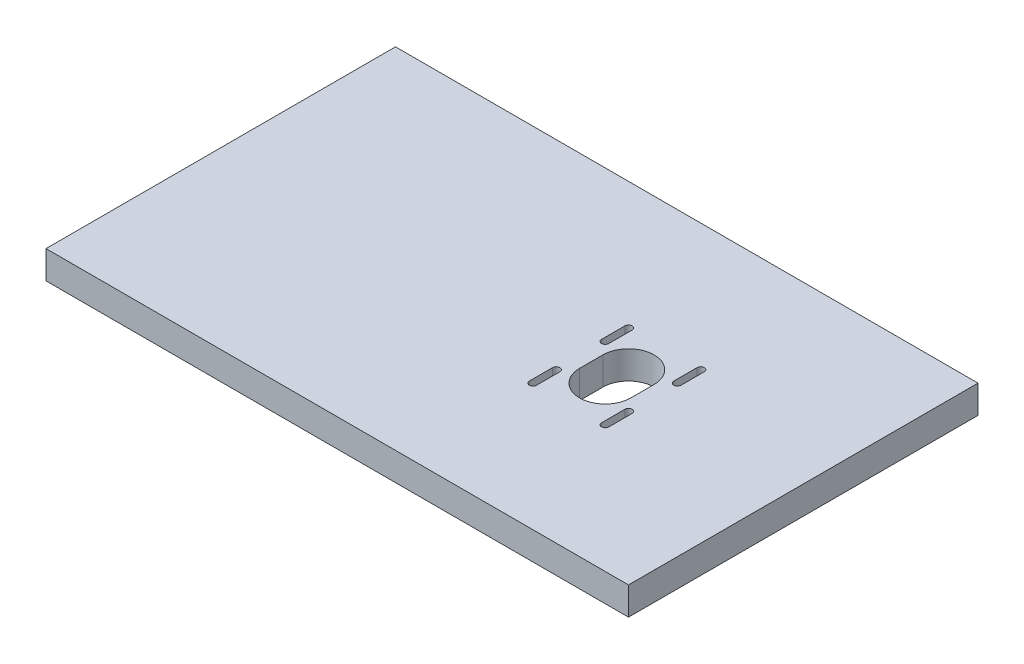
ISO-10303-21;
HEADER;
FILE_DESCRIPTION(('STEP AP214'),'2;1');
FILE_NAME('part.step','',(''),(''),'','','');
FILE_SCHEMA(('AUTOMOTIVE_DESIGN { 1 0 10303 214 1 1 1 1 }'));
ENDSEC;
DATA;
#1=APPLICATION_CONTEXT('core data for automotive mechanical design processes');
#2=APPLICATION_PROTOCOL_DEFINITION('international standard','automotive_design',2000,#1);
#3=PRODUCT_CONTEXT('',#1,'mechanical');
#4=PRODUCT('Part','Part','',(#3));
#5=PRODUCT_RELATED_PRODUCT_CATEGORY('part','',(#4));
#6=PRODUCT_DEFINITION_FORMATION('','',#4);
#7=PRODUCT_DEFINITION_CONTEXT('part definition',#1,'design');
#8=PRODUCT_DEFINITION('design','',#6,#7);
#9=PRODUCT_DEFINITION_SHAPE('','',#8);
#10=(LENGTH_UNIT() NAMED_UNIT(*) SI_UNIT(.MILLI.,.METRE.));
#11=(NAMED_UNIT(*) PLANE_ANGLE_UNIT() SI_UNIT($,.RADIAN.));
#12=(NAMED_UNIT(*) SI_UNIT($,.STERADIAN.) SOLID_ANGLE_UNIT());
#13=UNCERTAINTY_MEASURE_WITH_UNIT(LENGTH_MEASURE(1.E-05),#10,'distance_accuracy_value','');
#14=(GEOMETRIC_REPRESENTATION_CONTEXT(3) GLOBAL_UNCERTAINTY_ASSIGNED_CONTEXT((#13)) GLOBAL_UNIT_ASSIGNED_CONTEXT((#10,
#11,#12)) REPRESENTATION_CONTEXT('',''));
#15=CARTESIAN_POINT('',(0.,0.,0.));
#16=DIRECTION('',(0.,0.,1.));
#17=DIRECTION('',(1.,0.,0.));
#18=AXIS2_PLACEMENT_3D('',#15,#16,#17);
#19=CARTESIAN_POINT('',(0.,12.,0.));
#20=DIRECTION('',(0.,1.,0.));
#21=DIRECTION('',(0.,0.,1.));
#22=AXIS2_PLACEMENT_3D('',#19,#20,#21);
#23=PLANE('',#22);
#24=DIRECTION('',(0.,0.,-1.));
#25=VECTOR('',#24,1.);
#26=CARTESIAN_POINT('',(125.,12.,-75.));
#27=LINE('',#26,#25);
#28=CARTESIAN_POINT('',(125.,12.,75.));
#29=VERTEX_POINT('',#28);
#30=CARTESIAN_POINT('',(125.,12.,-75.));
#31=VERTEX_POINT('',#30);
#32=EDGE_CURVE('E356',#29,#31,#27,.T.);
#33=ORIENTED_EDGE('',*,*,#32,.T.);
#34=DIRECTION('',(-1.,0.,0.));
#35=VECTOR('',#34,1.);
#36=CARTESIAN_POINT('',(-125.,12.,-75.));
#37=LINE('',#36,#35);
#38=CARTESIAN_POINT('',(-125.,12.,-75.));
#39=VERTEX_POINT('',#38);
#40=EDGE_CURVE('E359',#31,#39,#37,.T.);
#41=ORIENTED_EDGE('',*,*,#40,.T.);
#42=DIRECTION('',(0.,0.,1.));
#43=VECTOR('',#42,1.);
#44=CARTESIAN_POINT('',(-125.,12.,-75.));
#45=LINE('',#44,#43);
#46=CARTESIAN_POINT('',(-125.,12.,75.));
#47=VERTEX_POINT('',#46);
#48=EDGE_CURVE('E362',#39,#47,#45,.T.);
#49=ORIENTED_EDGE('',*,*,#48,.T.);
#50=DIRECTION('',(1.,0.,0.));
#51=VECTOR('',#50,1.);
#52=CARTESIAN_POINT('',(-125.,12.,75.));
#53=LINE('',#52,#51);
#54=EDGE_CURVE('E364',#47,#29,#53,.T.);
#55=ORIENTED_EDGE('',*,*,#54,.T.);
#56=EDGE_LOOP('',(#33,#41,#49,#55));
#57=FACE_BOUND('',#56,.T.);
#58=DIRECTION('',(0.,0.,-1.));
#59=VECTOR('',#58,1.);
#60=CARTESIAN_POINT('',(31.05,12.,-10.5));
#61=LINE('',#60,#59);
#62=CARTESIAN_POINT('',(31.05,12.,-10.5));
#63=VERTEX_POINT('',#62);
#64=CARTESIAN_POINT('',(31.05,12.,-20.5000000000001));
#65=VERTEX_POINT('',#64);
#66=EDGE_CURVE('E327',#63,#65,#61,.T.);
#67=ORIENTED_EDGE('',*,*,#66,.F.);
#68=CARTESIAN_POINT('',(29.5,12.,-10.5));
#69=DIRECTION('',(0.,1.,0.));
#70=DIRECTION('',(0.,0.,1.));
#71=AXIS2_PLACEMENT_3D('',#68,#69,#70);
#72=CIRCLE('',#71,1.55000000000001);
#73=CARTESIAN_POINT('',(27.9499999999999,12.,-10.5));
#74=VERTEX_POINT('',#73);
#75=EDGE_CURVE('E325',#74,#63,#72,.T.);
#76=ORIENTED_EDGE('',*,*,#75,.F.);
#77=DIRECTION('',(0.,0.,1.));
#78=VECTOR('',#77,1.);
#79=CARTESIAN_POINT('',(27.9499999999999,12.,-10.5));
#80=LINE('',#79,#78);
#81=CARTESIAN_POINT('',(27.9499999999999,12.,-20.5000000000001));
#82=VERTEX_POINT('',#81);
#83=EDGE_CURVE('E333',#82,#74,#80,.T.);
#84=ORIENTED_EDGE('',*,*,#83,.F.);
#85=CARTESIAN_POINT('',(29.5,12.,-20.5000000000001));
#86=DIRECTION('',(0.,1.,0.));
#87=DIRECTION('',(0.,0.,1.));
#88=AXIS2_PLACEMENT_3D('',#85,#86,#87);
#89=CIRCLE('',#88,1.55000000000002);
#90=EDGE_CURVE('E330',#65,#82,#89,.T.);
#91=ORIENTED_EDGE('',*,*,#90,.F.);
#92=EDGE_LOOP('',(#67,#76,#84,#91));
#93=FACE_BOUND('',#92,.T.);
#94=DIRECTION('',(0.,0.,1.));
#95=VECTOR('',#94,1.);
#96=CARTESIAN_POINT('',(58.95,12.,-20.5000000000001));
#97=LINE('',#96,#95);
#98=CARTESIAN_POINT('',(58.95,12.,-20.5000000000001));
#99=VERTEX_POINT('',#98);
#100=CARTESIAN_POINT('',(58.95,12.,-10.5));
#101=VERTEX_POINT('',#100);
#102=EDGE_CURVE('E296',#99,#101,#97,.T.);
#103=ORIENTED_EDGE('',*,*,#102,.F.);
#104=CARTESIAN_POINT('',(60.5,12.,-20.5000000000001));
#105=DIRECTION('',(0.,1.,0.));
#106=DIRECTION('',(0.,0.,1.));
#107=AXIS2_PLACEMENT_3D('',#104,#105,#106);
#108=CIRCLE('',#107,1.55);
#109=CARTESIAN_POINT('',(62.05,12.,-20.5000000000001));
#110=VERTEX_POINT('',#109);
#111=EDGE_CURVE('E294',#110,#99,#108,.T.);
#112=ORIENTED_EDGE('',*,*,#111,.F.);
#113=DIRECTION('',(0.,0.,-1.));
#114=VECTOR('',#113,1.);
#115=CARTESIAN_POINT('',(62.05,12.,-20.5000000000001));
#116=LINE('',#115,#114);
#117=CARTESIAN_POINT('',(62.05,12.,-10.5));
#118=VERTEX_POINT('',#117);
#119=EDGE_CURVE('E302',#118,#110,#116,.T.);
#120=ORIENTED_EDGE('',*,*,#119,.F.);
#121=CARTESIAN_POINT('',(60.5,12.,-10.5));
#122=DIRECTION('',(0.,1.,0.));
#123=DIRECTION('',(0.,0.,1.));
#124=AXIS2_PLACEMENT_3D('',#121,#122,#123);
#125=CIRCLE('',#124,1.55);
#126=EDGE_CURVE('E299',#101,#118,#125,.T.);
#127=ORIENTED_EDGE('',*,*,#126,.F.);
#128=EDGE_LOOP('',(#103,#112,#120,#127));
#129=FACE_BOUND('',#128,.T.);
#130=DIRECTION('',(0.,0.,-1.));
#131=VECTOR('',#130,1.);
#132=CARTESIAN_POINT('',(62.05,12.,20.5));
#133=LINE('',#132,#131);
#134=CARTESIAN_POINT('',(62.05,12.,20.5));
#135=VERTEX_POINT('',#134);
#136=CARTESIAN_POINT('',(62.0500000000001,12.,10.5));
#137=VERTEX_POINT('',#136);
#138=EDGE_CURVE('E265',#135,#137,#133,.T.);
#139=ORIENTED_EDGE('',*,*,#138,.F.);
#140=CARTESIAN_POINT('',(60.5000000000001,12.,20.5));
#141=DIRECTION('',(0.,1.,0.));
#142=DIRECTION('',(0.,0.,1.));
#143=AXIS2_PLACEMENT_3D('',#140,#141,#142);
#144=CIRCLE('',#143,1.55000000000001);
#145=CARTESIAN_POINT('',(58.95,12.,20.5));
#146=VERTEX_POINT('',#145);
#147=EDGE_CURVE('E263',#146,#135,#144,.T.);
#148=ORIENTED_EDGE('',*,*,#147,.F.);
#149=DIRECTION('',(0.,0.,1.));
#150=VECTOR('',#149,1.);
#151=CARTESIAN_POINT('',(58.95,12.,20.5));
#152=LINE('',#151,#150);
#153=CARTESIAN_POINT('',(58.95,12.,10.5));
#154=VERTEX_POINT('',#153);
#155=EDGE_CURVE('E271',#154,#146,#152,.T.);
#156=ORIENTED_EDGE('',*,*,#155,.F.);
#157=CARTESIAN_POINT('',(60.5000000000001,12.,10.5));
#158=DIRECTION('',(0.,1.,0.));
#159=DIRECTION('',(0.,0.,1.));
#160=AXIS2_PLACEMENT_3D('',#157,#158,#159);
#161=CIRCLE('',#160,1.55000000000001);
#162=EDGE_CURVE('E268',#137,#154,#161,.T.);
#163=ORIENTED_EDGE('',*,*,#162,.F.);
#164=EDGE_LOOP('',(#139,#148,#156,#163));
#165=FACE_BOUND('',#164,.T.);
#166=DIRECTION('',(0.,0.,-1.));
#167=VECTOR('',#166,1.);
#168=CARTESIAN_POINT('',(31.05,12.,20.5));
#169=LINE('',#168,#167);
#170=CARTESIAN_POINT('',(31.05,12.,20.5));
#171=VERTEX_POINT('',#170);
#172=CARTESIAN_POINT('',(31.05,12.,10.5));
#173=VERTEX_POINT('',#172);
#174=EDGE_CURVE('E234',#171,#173,#169,.T.);
#175=ORIENTED_EDGE('',*,*,#174,.F.);
#176=CARTESIAN_POINT('',(29.5,12.,20.5));
#177=DIRECTION('',(0.,1.,0.));
#178=DIRECTION('',(0.,0.,1.));
#179=AXIS2_PLACEMENT_3D('',#176,#177,#178);
#180=CIRCLE('',#179,1.55);
#181=CARTESIAN_POINT('',(27.95,12.,20.5));
#182=VERTEX_POINT('',#181);
#183=EDGE_CURVE('E232',#182,#171,#180,.T.);
#184=ORIENTED_EDGE('',*,*,#183,.F.);
#185=DIRECTION('',(0.,0.,1.));
#186=VECTOR('',#185,1.);
#187=CARTESIAN_POINT('',(27.95,12.,20.5));
#188=LINE('',#187,#186);
#189=CARTESIAN_POINT('',(27.95,12.,10.5));
#190=VERTEX_POINT('',#189);
#191=EDGE_CURVE('E240',#190,#182,#188,.T.);
#192=ORIENTED_EDGE('',*,*,#191,.F.);
#193=CARTESIAN_POINT('',(29.5,12.,10.5));
#194=DIRECTION('',(0.,1.,0.));
#195=DIRECTION('',(0.,0.,1.));
#196=AXIS2_PLACEMENT_3D('',#193,#194,#195);
#197=CIRCLE('',#196,1.55);
#198=EDGE_CURVE('E237',#173,#190,#197,.T.);
#199=ORIENTED_EDGE('',*,*,#198,.F.);
#200=EDGE_LOOP('',(#175,#184,#192,#199));
#201=FACE_BOUND('',#200,.T.);
#202=DIRECTION('',(0.,0.,1.));
#203=VECTOR('',#202,1.);
#204=CARTESIAN_POINT('',(34.,12.,-5.00000000000009));
#205=LINE('',#204,#203);
#206=CARTESIAN_POINT('',(34.,12.,-5.00000000000009));
#207=VERTEX_POINT('',#206);
#208=CARTESIAN_POINT('',(34.,12.,5.));
#209=VERTEX_POINT('',#208);
#210=EDGE_CURVE('E204',#207,#209,#205,.T.);
#211=ORIENTED_EDGE('',*,*,#210,.F.);
#212=CARTESIAN_POINT('',(45.,12.,-5.0000000000001));
#213=DIRECTION('',(0.,1.,0.));
#214=DIRECTION('',(0.,0.,1.));
#215=AXIS2_PLACEMENT_3D('',#212,#213,#214);
#216=CIRCLE('',#215,11.);
#217=CARTESIAN_POINT('',(56.,12.,-5.00000000000011));
#218=VERTEX_POINT('',#217);
#219=EDGE_CURVE('E196',#218,#207,#216,.T.);
#220=ORIENTED_EDGE('',*,*,#219,.F.);
#221=DIRECTION('',(0.,0.,-1.));
#222=VECTOR('',#221,1.);
#223=CARTESIAN_POINT('',(56.,12.,-5.00000000000011));
#224=LINE('',#223,#222);
#225=CARTESIAN_POINT('',(56.,12.,5.));
#226=VERTEX_POINT('',#225);
#227=EDGE_CURVE('E218',#226,#218,#224,.T.);
#228=ORIENTED_EDGE('',*,*,#227,.F.);
#229=CARTESIAN_POINT('',(45.,12.,5.));
#230=DIRECTION('',(0.,1.,0.));
#231=DIRECTION('',(0.,0.,1.));
#232=AXIS2_PLACEMENT_3D('',#229,#230,#231);
#233=CIRCLE('',#232,11.);
#234=EDGE_CURVE('E216',#209,#226,#233,.T.);
#235=ORIENTED_EDGE('',*,*,#234,.F.);
#236=EDGE_LOOP('',(#211,#220,#228,#235));
#237=FACE_BOUND('',#236,.T.);
#238=ADVANCED_FACE('F35',(#57,#93,#129,#165,#201,#237),#23,.T.);
#239=CARTESIAN_POINT('',(0.,0.,0.));
#240=DIRECTION('',(0.,1.,0.));
#241=DIRECTION('',(0.,0.,1.));
#242=AXIS2_PLACEMENT_3D('',#239,#240,#241);
#243=PLANE('',#242);
#244=CARTESIAN_POINT('',(29.5,0.,20.5));
#245=DIRECTION('',(0.,1.,0.));
#246=DIRECTION('',(0.,0.,1.));
#247=AXIS2_PLACEMENT_3D('',#244,#245,#246);
#248=CIRCLE('',#247,1.55);
#249=CARTESIAN_POINT('',(27.95,0.,20.5));
#250=VERTEX_POINT('',#249);
#251=CARTESIAN_POINT('',(31.05,0.,20.5));
#252=VERTEX_POINT('',#251);
#253=EDGE_CURVE('E212',#250,#252,#248,.T.);
#254=ORIENTED_EDGE('',*,*,#253,.T.);
#255=DIRECTION('',(0.,0.,-1.));
#256=VECTOR('',#255,1.);
#257=CARTESIAN_POINT('',(31.05,0.,20.5));
#258=LINE('',#257,#256);
#259=CARTESIAN_POINT('',(31.05,0.,10.5));
#260=VERTEX_POINT('',#259);
#261=EDGE_CURVE('E245',#252,#260,#258,.T.);
#262=ORIENTED_EDGE('',*,*,#261,.T.);
#263=CARTESIAN_POINT('',(29.5,0.,10.5));
#264=DIRECTION('',(0.,1.,0.));
#265=DIRECTION('',(0.,0.,1.));
#266=AXIS2_PLACEMENT_3D('',#263,#264,#265);
#267=CIRCLE('',#266,1.55);
#268=CARTESIAN_POINT('',(27.95,0.,10.5));
#269=VERTEX_POINT('',#268);
#270=EDGE_CURVE('E248',#260,#269,#267,.T.);
#271=ORIENTED_EDGE('',*,*,#270,.T.);
#272=DIRECTION('',(0.,0.,1.));
#273=VECTOR('',#272,1.);
#274=CARTESIAN_POINT('',(27.95,0.,20.5));
#275=LINE('',#274,#273);
#276=EDGE_CURVE('E235',#269,#250,#275,.T.);
#277=ORIENTED_EDGE('',*,*,#276,.T.);
#278=EDGE_LOOP('',(#254,#262,#271,#277));
#279=FACE_BOUND('',#278,.T.);
#280=CARTESIAN_POINT('',(60.5,0.,-20.5000000000001));
#281=DIRECTION('',(0.,1.,0.));
#282=DIRECTION('',(0.,0.,1.));
#283=AXIS2_PLACEMENT_3D('',#280,#281,#282);
#284=CIRCLE('',#283,1.55);
#285=CARTESIAN_POINT('',(62.05,0.,-20.5000000000001));
#286=VERTEX_POINT('',#285);
#287=CARTESIAN_POINT('',(58.95,0.,-20.5000000000001));
#288=VERTEX_POINT('',#287);
#289=EDGE_CURVE('E293',#286,#288,#284,.T.);
#290=ORIENTED_EDGE('',*,*,#289,.T.);
#291=DIRECTION('',(0.,0.,1.));
#292=VECTOR('',#291,1.);
#293=CARTESIAN_POINT('',(58.95,0.,-20.5000000000001));
#294=LINE('',#293,#292);
#295=CARTESIAN_POINT('',(58.95,0.,-10.5));
#296=VERTEX_POINT('',#295);
#297=EDGE_CURVE('E307',#288,#296,#294,.T.);
#298=ORIENTED_EDGE('',*,*,#297,.T.);
#299=CARTESIAN_POINT('',(60.5,0.,-10.5));
#300=DIRECTION('',(0.,1.,0.));
#301=DIRECTION('',(0.,0.,1.));
#302=AXIS2_PLACEMENT_3D('',#299,#300,#301);
#303=CIRCLE('',#302,1.55);
#304=CARTESIAN_POINT('',(62.05,0.,-10.5));
#305=VERTEX_POINT('',#304);
#306=EDGE_CURVE('E310',#296,#305,#303,.T.);
#307=ORIENTED_EDGE('',*,*,#306,.T.);
#308=DIRECTION('',(0.,0.,-1.));
#309=VECTOR('',#308,1.);
#310=CARTESIAN_POINT('',(62.05,0.,-20.5000000000001));
#311=LINE('',#310,#309);
#312=EDGE_CURVE('E297',#305,#286,#311,.T.);
#313=ORIENTED_EDGE('',*,*,#312,.T.);
#314=EDGE_LOOP('',(#290,#298,#307,#313));
#315=FACE_BOUND('',#314,.T.);
#316=DIRECTION('',(0.,0.,-1.));
#317=VECTOR('',#316,1.);
#318=CARTESIAN_POINT('',(125.,0.,-75.));
#319=LINE('',#318,#317);
#320=CARTESIAN_POINT('',(125.,0.,75.));
#321=VERTEX_POINT('',#320);
#322=CARTESIAN_POINT('',(125.,0.,-75.));
#323=VERTEX_POINT('',#322);
#324=EDGE_CURVE('E355',#321,#323,#319,.T.);
#325=ORIENTED_EDGE('',*,*,#324,.F.);
#326=DIRECTION('',(1.,0.,0.));
#327=VECTOR('',#326,1.);
#328=CARTESIAN_POINT('',(-125.,0.,75.));
#329=LINE('',#328,#327);
#330=CARTESIAN_POINT('',(-125.,0.,75.));
#331=VERTEX_POINT('',#330);
#332=EDGE_CURVE('E360',#331,#321,#329,.T.);
#333=ORIENTED_EDGE('',*,*,#332,.F.);
#334=DIRECTION('',(0.,0.,1.));
#335=VECTOR('',#334,1.);
#336=CARTESIAN_POINT('',(-125.,0.,-75.));
#337=LINE('',#336,#335);
#338=CARTESIAN_POINT('',(-125.,0.,-75.));
#339=VERTEX_POINT('',#338);
#340=EDGE_CURVE('E371',#339,#331,#337,.T.);
#341=ORIENTED_EDGE('',*,*,#340,.F.);
#342=DIRECTION('',(-1.,0.,0.));
#343=VECTOR('',#342,1.);
#344=CARTESIAN_POINT('',(-125.,0.,-75.));
#345=LINE('',#344,#343);
#346=EDGE_CURVE('E369',#323,#339,#345,.T.);
#347=ORIENTED_EDGE('',*,*,#346,.F.);
#348=EDGE_LOOP('',(#325,#333,#341,#347));
#349=FACE_BOUND('',#348,.T.);
#350=CARTESIAN_POINT('',(29.5,0.,-10.5));
#351=DIRECTION('',(0.,1.,0.));
#352=DIRECTION('',(0.,0.,1.));
#353=AXIS2_PLACEMENT_3D('',#350,#351,#352);
#354=CIRCLE('',#353,1.55000000000001);
#355=CARTESIAN_POINT('',(27.9499999999999,0.,-10.5));
#356=VERTEX_POINT('',#355);
#357=CARTESIAN_POINT('',(31.05,0.,-10.5));
#358=VERTEX_POINT('',#357);
#359=EDGE_CURVE('E324',#356,#358,#354,.T.);
#360=ORIENTED_EDGE('',*,*,#359,.T.);
#361=DIRECTION('',(0.,0.,-1.));
#362=VECTOR('',#361,1.);
#363=CARTESIAN_POINT('',(31.05,0.,-10.5));
#364=LINE('',#363,#362);
#365=CARTESIAN_POINT('',(31.05,0.,-20.5000000000001));
#366=VERTEX_POINT('',#365);
#367=EDGE_CURVE('E338',#358,#366,#364,.T.);
#368=ORIENTED_EDGE('',*,*,#367,.T.);
#369=CARTESIAN_POINT('',(29.5,0.,-20.5000000000001));
#370=DIRECTION('',(0.,1.,0.));
#371=DIRECTION('',(0.,0.,1.));
#372=AXIS2_PLACEMENT_3D('',#369,#370,#371);
#373=CIRCLE('',#372,1.55000000000002);
#374=CARTESIAN_POINT('',(27.9499999999999,0.,-20.5000000000001));
#375=VERTEX_POINT('',#374);
#376=EDGE_CURVE('E341',#366,#375,#373,.T.);
#377=ORIENTED_EDGE('',*,*,#376,.T.);
#378=DIRECTION('',(0.,0.,1.));
#379=VECTOR('',#378,1.);
#380=CARTESIAN_POINT('',(27.9499999999999,0.,-10.5));
#381=LINE('',#380,#379);
#382=EDGE_CURVE('E328',#375,#356,#381,.T.);
#383=ORIENTED_EDGE('',*,*,#382,.T.);
#384=EDGE_LOOP('',(#360,#368,#377,#383));
#385=FACE_BOUND('',#384,.T.);
#386=CARTESIAN_POINT('',(60.5000000000001,0.,20.5));
#387=DIRECTION('',(0.,1.,0.));
#388=DIRECTION('',(0.,0.,1.));
#389=AXIS2_PLACEMENT_3D('',#386,#387,#388);
#390=CIRCLE('',#389,1.55000000000001);
#391=CARTESIAN_POINT('',(58.95,0.,20.5));
#392=VERTEX_POINT('',#391);
#393=CARTESIAN_POINT('',(62.05,0.,20.5));
#394=VERTEX_POINT('',#393);
#395=EDGE_CURVE('E262',#392,#394,#390,.T.);
#396=ORIENTED_EDGE('',*,*,#395,.T.);
#397=DIRECTION('',(0.,0.,-1.));
#398=VECTOR('',#397,1.);
#399=CARTESIAN_POINT('',(62.05,0.,20.5));
#400=LINE('',#399,#398);
#401=CARTESIAN_POINT('',(62.0500000000001,0.,10.5));
#402=VERTEX_POINT('',#401);
#403=EDGE_CURVE('E276',#394,#402,#400,.T.);
#404=ORIENTED_EDGE('',*,*,#403,.T.);
#405=CARTESIAN_POINT('',(60.5000000000001,0.,10.5));
#406=DIRECTION('',(0.,1.,0.));
#407=DIRECTION('',(0.,0.,1.));
#408=AXIS2_PLACEMENT_3D('',#405,#406,#407);
#409=CIRCLE('',#408,1.55000000000001);
#410=CARTESIAN_POINT('',(58.95,0.,10.5));
#411=VERTEX_POINT('',#410);
#412=EDGE_CURVE('E279',#402,#411,#409,.T.);
#413=ORIENTED_EDGE('',*,*,#412,.T.);
#414=DIRECTION('',(0.,0.,1.));
#415=VECTOR('',#414,1.);
#416=CARTESIAN_POINT('',(58.95,0.,20.5));
#417=LINE('',#416,#415);
#418=EDGE_CURVE('E266',#411,#392,#417,.T.);
#419=ORIENTED_EDGE('',*,*,#418,.T.);
#420=EDGE_LOOP('',(#396,#404,#413,#419));
#421=FACE_BOUND('',#420,.T.);
#422=CARTESIAN_POINT('',(45.,0.,-5.0000000000001));
#423=DIRECTION('',(0.,1.,0.));
#424=DIRECTION('',(0.,0.,1.));
#425=AXIS2_PLACEMENT_3D('',#422,#423,#424);
#426=CIRCLE('',#425,11.);
#427=CARTESIAN_POINT('',(56.,0.,-5.00000000000011));
#428=VERTEX_POINT('',#427);
#429=CARTESIAN_POINT('',(34.,0.,-5.00000000000009));
#430=VERTEX_POINT('',#429);
#431=EDGE_CURVE('E58',#428,#430,#426,.T.);
#432=ORIENTED_EDGE('',*,*,#431,.T.);
#433=DIRECTION('',(0.,0.,1.));
#434=VECTOR('',#433,1.);
#435=CARTESIAN_POINT('',(34.,0.,-5.00000000000009));
#436=LINE('',#435,#434);
#437=CARTESIAN_POINT('',(34.,0.,5.));
#438=VERTEX_POINT('',#437);
#439=EDGE_CURVE('E211',#430,#438,#436,.T.);
#440=ORIENTED_EDGE('',*,*,#439,.T.);
#441=CARTESIAN_POINT('',(45.,0.,5.));
#442=DIRECTION('',(0.,1.,0.));
#443=DIRECTION('',(0.,0.,1.));
#444=AXIS2_PLACEMENT_3D('',#441,#442,#443);
#445=CIRCLE('',#444,11.);
#446=CARTESIAN_POINT('',(56.,0.,5.));
#447=VERTEX_POINT('',#446);
#448=EDGE_CURVE('E224',#438,#447,#445,.T.);
#449=ORIENTED_EDGE('',*,*,#448,.T.);
#450=DIRECTION('',(0.,0.,-1.));
#451=VECTOR('',#450,1.);
#452=CARTESIAN_POINT('',(56.,0.,-5.00000000000011));
#453=LINE('',#452,#451);
#454=EDGE_CURVE('E205',#447,#428,#453,.T.);
#455=ORIENTED_EDGE('',*,*,#454,.T.);
#456=EDGE_LOOP('',(#432,#440,#449,#455));
#457=FACE_BOUND('',#456,.T.);
#458=ADVANCED_FACE('F389',(#279,#315,#349,#385,#421,#457),#243,.F.);
#459=CARTESIAN_POINT('',(125.,12.,-75.));
#460=DIRECTION('',(-1.,0.,0.));
#461=DIRECTION('',(0.,0.,1.));
#462=AXIS2_PLACEMENT_3D('',#459,#460,#461);
#463=PLANE('',#462);
#464=ORIENTED_EDGE('',*,*,#324,.T.);
#465=DIRECTION('',(0.,-1.,0.));
#466=VECTOR('',#465,1.);
#467=CARTESIAN_POINT('',(125.,12.,-75.));
#468=LINE('',#467,#466);
#469=EDGE_CURVE('E11',#31,#323,#468,.T.);
#470=ORIENTED_EDGE('',*,*,#469,.F.);
#471=ORIENTED_EDGE('',*,*,#32,.F.);
#472=DIRECTION('',(0.,-1.,0.));
#473=VECTOR('',#472,1.);
#474=CARTESIAN_POINT('',(125.,12.,75.));
#475=LINE('',#474,#473);
#476=EDGE_CURVE('E366',#29,#321,#475,.T.);
#477=ORIENTED_EDGE('',*,*,#476,.T.);
#478=EDGE_LOOP('',(#464,#470,#471,#477));
#479=FACE_BOUND('',#478,.T.);
#480=ADVANCED_FACE('F37',(#479),#463,.F.);
#481=CARTESIAN_POINT('',(-125.,12.,-75.));
#482=DIRECTION('',(0.,0.,1.));
#483=DIRECTION('',(1.,0.,0.));
#484=AXIS2_PLACEMENT_3D('',#481,#482,#483);
#485=PLANE('',#484);
#486=ORIENTED_EDGE('',*,*,#346,.T.);
#487=DIRECTION('',(0.,-1.,0.));
#488=VECTOR('',#487,1.);
#489=CARTESIAN_POINT('',(-125.,12.,-75.));
#490=LINE('',#489,#488);
#491=EDGE_CURVE('E43',#39,#339,#490,.T.);
#492=ORIENTED_EDGE('',*,*,#491,.F.);
#493=ORIENTED_EDGE('',*,*,#40,.F.);
#494=ORIENTED_EDGE('',*,*,#469,.T.);
#495=EDGE_LOOP('',(#486,#492,#493,#494));
#496=FACE_BOUND('',#495,.T.);
#497=ADVANCED_FACE('F400',(#496),#485,.F.);
#498=CARTESIAN_POINT('',(-125.,12.,-75.));
#499=DIRECTION('',(1.,0.,0.));
#500=DIRECTION('',(0.,0.,-1.));
#501=AXIS2_PLACEMENT_3D('',#498,#499,#500);
#502=PLANE('',#501);
#503=ORIENTED_EDGE('',*,*,#340,.T.);
#504=DIRECTION('',(0.,-1.,0.));
#505=VECTOR('',#504,1.);
#506=CARTESIAN_POINT('',(-125.,12.,75.));
#507=LINE('',#506,#505);
#508=EDGE_CURVE('E376',#47,#331,#507,.T.);
#509=ORIENTED_EDGE('',*,*,#508,.F.);
#510=ORIENTED_EDGE('',*,*,#48,.F.);
#511=ORIENTED_EDGE('',*,*,#491,.T.);
#512=EDGE_LOOP('',(#503,#509,#510,#511));
#513=FACE_BOUND('',#512,.T.);
#514=ADVANCED_FACE('F383',(#513),#502,.F.);
#515=CARTESIAN_POINT('',(-125.,12.,75.));
#516=DIRECTION('',(0.,0.,-1.));
#517=DIRECTION('',(-1.,0.,0.));
#518=AXIS2_PLACEMENT_3D('',#515,#516,#517);
#519=PLANE('',#518);
#520=ORIENTED_EDGE('',*,*,#332,.T.);
#521=ORIENTED_EDGE('',*,*,#476,.F.);
#522=ORIENTED_EDGE('',*,*,#54,.F.);
#523=ORIENTED_EDGE('',*,*,#508,.T.);
#524=EDGE_LOOP('',(#520,#521,#522,#523));
#525=FACE_BOUND('',#524,.T.);
#526=ADVANCED_FACE('F393',(#525),#519,.F.);
#527=CARTESIAN_POINT('',(29.5,12.,-10.5));
#528=DIRECTION('',(0.,-1.,0.));
#529=DIRECTION('',(0.,0.,-1.));
#530=AXIS2_PLACEMENT_3D('',#527,#528,#529);
#531=CYLINDRICAL_SURFACE('',#530,1.55000000000001);
#532=ORIENTED_EDGE('',*,*,#359,.F.);
#533=DIRECTION('',(0.,-1.,0.));
#534=VECTOR('',#533,1.);
#535=CARTESIAN_POINT('',(27.9499999999999,12.,-10.5));
#536=LINE('',#535,#534);
#537=EDGE_CURVE('E335',#74,#356,#536,.T.);
#538=ORIENTED_EDGE('',*,*,#537,.F.);
#539=ORIENTED_EDGE('',*,*,#75,.T.);
#540=DIRECTION('',(0.,-1.,0.));
#541=VECTOR('',#540,1.);
#542=CARTESIAN_POINT('',(31.05,12.,-10.5));
#543=LINE('',#542,#541);
#544=EDGE_CURVE('E352',#63,#358,#543,.T.);
#545=ORIENTED_EDGE('',*,*,#544,.T.);
#546=EDGE_LOOP('',(#532,#538,#539,#545));
#547=FACE_BOUND('',#546,.T.);
#548=ADVANCED_FACE('F415',(#547),#531,.F.);
#549=CARTESIAN_POINT('',(31.05,12.,-10.5));
#550=DIRECTION('',(-1.,0.,0.));
#551=DIRECTION('',(0.,0.,1.));
#552=AXIS2_PLACEMENT_3D('',#549,#550,#551);
#553=PLANE('',#552);
#554=ORIENTED_EDGE('',*,*,#367,.F.);
#555=ORIENTED_EDGE('',*,*,#544,.F.);
#556=ORIENTED_EDGE('',*,*,#66,.T.);
#557=DIRECTION('',(0.,-1.,0.));
#558=VECTOR('',#557,1.);
#559=CARTESIAN_POINT('',(31.05,12.,-20.5000000000001));
#560=LINE('',#559,#558);
#561=EDGE_CURVE('E350',#65,#366,#560,.T.);
#562=ORIENTED_EDGE('',*,*,#561,.T.);
#563=EDGE_LOOP('',(#554,#555,#556,#562));
#564=FACE_BOUND('',#563,.T.);
#565=ADVANCED_FACE('F422',(#564),#553,.T.);
#566=CARTESIAN_POINT('',(29.5,12.,-20.5000000000001));
#567=DIRECTION('',(0.,-1.,0.));
#568=DIRECTION('',(0.,0.,-1.));
#569=AXIS2_PLACEMENT_3D('',#566,#567,#568);
#570=CYLINDRICAL_SURFACE('',#569,1.55000000000002);
#571=ORIENTED_EDGE('',*,*,#376,.F.);
#572=ORIENTED_EDGE('',*,*,#561,.F.);
#573=ORIENTED_EDGE('',*,*,#90,.T.);
#574=DIRECTION('',(0.,-1.,0.));
#575=VECTOR('',#574,1.);
#576=CARTESIAN_POINT('',(27.9499999999999,12.,-20.5000000000001));
#577=LINE('',#576,#575);
#578=EDGE_CURVE('E348',#82,#375,#577,.T.);
#579=ORIENTED_EDGE('',*,*,#578,.T.);
#580=EDGE_LOOP('',(#571,#572,#573,#579));
#581=FACE_BOUND('',#580,.T.);
#582=ADVANCED_FACE('F427',(#581),#570,.F.);
#583=CARTESIAN_POINT('',(27.9499999999999,12.,-10.5));
#584=DIRECTION('',(1.,0.,0.));
#585=DIRECTION('',(0.,0.,-1.));
#586=AXIS2_PLACEMENT_3D('',#583,#584,#585);
#587=PLANE('',#586);
#588=ORIENTED_EDGE('',*,*,#382,.F.);
#589=ORIENTED_EDGE('',*,*,#578,.F.);
#590=ORIENTED_EDGE('',*,*,#83,.T.);
#591=ORIENTED_EDGE('',*,*,#537,.T.);
#592=EDGE_LOOP('',(#588,#589,#590,#591));
#593=FACE_BOUND('',#592,.T.);
#594=ADVANCED_FACE('F434',(#593),#587,.T.);
#595=CARTESIAN_POINT('',(60.5,12.,-20.5000000000001));
#596=DIRECTION('',(0.,-1.,0.));
#597=DIRECTION('',(0.,0.,-1.));
#598=AXIS2_PLACEMENT_3D('',#595,#596,#597);
#599=CYLINDRICAL_SURFACE('',#598,1.55);
#600=ORIENTED_EDGE('',*,*,#289,.F.);
#601=DIRECTION('',(0.,-1.,0.));
#602=VECTOR('',#601,1.);
#603=CARTESIAN_POINT('',(62.05,12.,-20.5000000000001));
#604=LINE('',#603,#602);
#605=EDGE_CURVE('E304',#110,#286,#604,.T.);
#606=ORIENTED_EDGE('',*,*,#605,.F.);
#607=ORIENTED_EDGE('',*,*,#111,.T.);
#608=DIRECTION('',(0.,-1.,0.));
#609=VECTOR('',#608,1.);
#610=CARTESIAN_POINT('',(58.95,12.,-20.5000000000001));
#611=LINE('',#610,#609);
#612=EDGE_CURVE('E321',#99,#288,#611,.T.);
#613=ORIENTED_EDGE('',*,*,#612,.T.);
#614=EDGE_LOOP('',(#600,#606,#607,#613));
#615=FACE_BOUND('',#614,.T.);
#616=ADVANCED_FACE('F510',(#615),#599,.F.);
#617=CARTESIAN_POINT('',(58.95,12.,-20.5000000000001));
#618=DIRECTION('',(1.,0.,0.));
#619=DIRECTION('',(0.,0.,-1.));
#620=AXIS2_PLACEMENT_3D('',#617,#618,#619);
#621=PLANE('',#620);
#622=ORIENTED_EDGE('',*,*,#297,.F.);
#623=ORIENTED_EDGE('',*,*,#612,.F.);
#624=ORIENTED_EDGE('',*,*,#102,.T.);
#625=DIRECTION('',(0.,-1.,0.));
#626=VECTOR('',#625,1.);
#627=CARTESIAN_POINT('',(58.95,12.,-10.5));
#628=LINE('',#627,#626);
#629=EDGE_CURVE('E319',#101,#296,#628,.T.);
#630=ORIENTED_EDGE('',*,*,#629,.T.);
#631=EDGE_LOOP('',(#622,#623,#624,#630));
#632=FACE_BOUND('',#631,.T.);
#633=ADVANCED_FACE('F506',(#632),#621,.T.);
#634=CARTESIAN_POINT('',(60.5,12.,-10.5));
#635=DIRECTION('',(0.,-1.,0.));
#636=DIRECTION('',(0.,0.,-1.));
#637=AXIS2_PLACEMENT_3D('',#634,#635,#636);
#638=CYLINDRICAL_SURFACE('',#637,1.55);
#639=ORIENTED_EDGE('',*,*,#306,.F.);
#640=ORIENTED_EDGE('',*,*,#629,.F.);
#641=ORIENTED_EDGE('',*,*,#126,.T.);
#642=DIRECTION('',(0.,-1.,0.));
#643=VECTOR('',#642,1.);
#644=CARTESIAN_POINT('',(62.05,12.,-10.5));
#645=LINE('',#644,#643);
#646=EDGE_CURVE('E317',#118,#305,#645,.T.);
#647=ORIENTED_EDGE('',*,*,#646,.T.);
#648=EDGE_LOOP('',(#639,#640,#641,#647));
#649=FACE_BOUND('',#648,.T.);
#650=ADVANCED_FACE('F502',(#649),#638,.F.);
#651=CARTESIAN_POINT('',(62.05,12.,-20.5000000000001));
#652=DIRECTION('',(-1.,0.,0.));
#653=DIRECTION('',(0.,0.,1.));
#654=AXIS2_PLACEMENT_3D('',#651,#652,#653);
#655=PLANE('',#654);
#656=ORIENTED_EDGE('',*,*,#312,.F.);
#657=ORIENTED_EDGE('',*,*,#646,.F.);
#658=ORIENTED_EDGE('',*,*,#119,.T.);
#659=ORIENTED_EDGE('',*,*,#605,.T.);
#660=EDGE_LOOP('',(#656,#657,#658,#659));
#661=FACE_BOUND('',#660,.T.);
#662=ADVANCED_FACE('F498',(#661),#655,.T.);
#663=CARTESIAN_POINT('',(60.5000000000001,12.,20.5));
#664=DIRECTION('',(0.,-1.,0.));
#665=DIRECTION('',(0.,0.,-1.));
#666=AXIS2_PLACEMENT_3D('',#663,#664,#665);
#667=CYLINDRICAL_SURFACE('',#666,1.55000000000001);
#668=ORIENTED_EDGE('',*,*,#395,.F.);
#669=DIRECTION('',(0.,-1.,0.));
#670=VECTOR('',#669,1.);
#671=CARTESIAN_POINT('',(58.95,12.,20.5));
#672=LINE('',#671,#670);
#673=EDGE_CURVE('E273',#146,#392,#672,.T.);
#674=ORIENTED_EDGE('',*,*,#673,.F.);
#675=ORIENTED_EDGE('',*,*,#147,.T.);
#676=DIRECTION('',(0.,-1.,0.));
#677=VECTOR('',#676,1.);
#678=CARTESIAN_POINT('',(62.05,12.,20.5));
#679=LINE('',#678,#677);
#680=EDGE_CURVE('E290',#135,#394,#679,.T.);
#681=ORIENTED_EDGE('',*,*,#680,.T.);
#682=EDGE_LOOP('',(#668,#674,#675,#681));
#683=FACE_BOUND('',#682,.T.);
#684=ADVANCED_FACE('F494',(#683),#667,.F.);
#685=CARTESIAN_POINT('',(62.05,12.,20.5));
#686=DIRECTION('',(-1.,0.,0.));
#687=DIRECTION('',(0.,0.,1.));
#688=AXIS2_PLACEMENT_3D('',#685,#686,#687);
#689=PLANE('',#688);
#690=ORIENTED_EDGE('',*,*,#403,.F.);
#691=ORIENTED_EDGE('',*,*,#680,.F.);
#692=ORIENTED_EDGE('',*,*,#138,.T.);
#693=DIRECTION('',(0.,-1.,0.));
#694=VECTOR('',#693,1.);
#695=CARTESIAN_POINT('',(62.0500000000001,12.,10.5));
#696=LINE('',#695,#694);
#697=EDGE_CURVE('E288',#137,#402,#696,.T.);
#698=ORIENTED_EDGE('',*,*,#697,.T.);
#699=EDGE_LOOP('',(#690,#691,#692,#698));
#700=FACE_BOUND('',#699,.T.);
#701=ADVANCED_FACE('F490',(#700),#689,.T.);
#702=CARTESIAN_POINT('',(60.5000000000001,12.,10.5));
#703=DIRECTION('',(0.,-1.,0.));
#704=DIRECTION('',(0.,0.,-1.));
#705=AXIS2_PLACEMENT_3D('',#702,#703,#704);
#706=CYLINDRICAL_SURFACE('',#705,1.55000000000001);
#707=ORIENTED_EDGE('',*,*,#412,.F.);
#708=ORIENTED_EDGE('',*,*,#697,.F.);
#709=ORIENTED_EDGE('',*,*,#162,.T.);
#710=DIRECTION('',(0.,-1.,0.));
#711=VECTOR('',#710,1.);
#712=CARTESIAN_POINT('',(58.95,12.,10.5));
#713=LINE('',#712,#711);
#714=EDGE_CURVE('E286',#154,#411,#713,.T.);
#715=ORIENTED_EDGE('',*,*,#714,.T.);
#716=EDGE_LOOP('',(#707,#708,#709,#715));
#717=FACE_BOUND('',#716,.T.);
#718=ADVANCED_FACE('F486',(#717),#706,.F.);
#719=CARTESIAN_POINT('',(58.95,12.,20.5));
#720=DIRECTION('',(1.,0.,0.));
#721=DIRECTION('',(0.,0.,-1.));
#722=AXIS2_PLACEMENT_3D('',#719,#720,#721);
#723=PLANE('',#722);
#724=ORIENTED_EDGE('',*,*,#418,.F.);
#725=ORIENTED_EDGE('',*,*,#714,.F.);
#726=ORIENTED_EDGE('',*,*,#155,.T.);
#727=ORIENTED_EDGE('',*,*,#673,.T.);
#728=EDGE_LOOP('',(#724,#725,#726,#727));
#729=FACE_BOUND('',#728,.T.);
#730=ADVANCED_FACE('F483',(#729),#723,.T.);
#731=CARTESIAN_POINT('',(29.5,12.,20.5));
#732=DIRECTION('',(0.,-1.,0.));
#733=DIRECTION('',(0.,0.,-1.));
#734=AXIS2_PLACEMENT_3D('',#731,#732,#733);
#735=CYLINDRICAL_SURFACE('',#734,1.55);
#736=ORIENTED_EDGE('',*,*,#253,.F.);
#737=DIRECTION('',(0.,-1.,0.));
#738=VECTOR('',#737,1.);
#739=CARTESIAN_POINT('',(27.95,12.,20.5));
#740=LINE('',#739,#738);
#741=EDGE_CURVE('E242',#182,#250,#740,.T.);
#742=ORIENTED_EDGE('',*,*,#741,.F.);
#743=ORIENTED_EDGE('',*,*,#183,.T.);
#744=DIRECTION('',(0.,-1.,0.));
#745=VECTOR('',#744,1.);
#746=CARTESIAN_POINT('',(31.05,12.,20.5));
#747=LINE('',#746,#745);
#748=EDGE_CURVE('E259',#171,#252,#747,.T.);
#749=ORIENTED_EDGE('',*,*,#748,.T.);
#750=EDGE_LOOP('',(#736,#742,#743,#749));
#751=FACE_BOUND('',#750,.T.);
#752=ADVANCED_FACE('F465',(#751),#735,.F.);
#753=CARTESIAN_POINT('',(31.05,12.,20.5));
#754=DIRECTION('',(-1.,0.,0.));
#755=DIRECTION('',(0.,0.,1.));
#756=AXIS2_PLACEMENT_3D('',#753,#754,#755);
#757=PLANE('',#756);
#758=ORIENTED_EDGE('',*,*,#261,.F.);
#759=ORIENTED_EDGE('',*,*,#748,.F.);
#760=ORIENTED_EDGE('',*,*,#174,.T.);
#761=DIRECTION('',(0.,-1.,0.));
#762=VECTOR('',#761,1.);
#763=CARTESIAN_POINT('',(31.05,12.,10.5));
#764=LINE('',#763,#762);
#765=EDGE_CURVE('E257',#173,#260,#764,.T.);
#766=ORIENTED_EDGE('',*,*,#765,.T.);
#767=EDGE_LOOP('',(#758,#759,#760,#766));
#768=FACE_BOUND('',#767,.T.);
#769=ADVANCED_FACE('F458',(#768),#757,.T.);
#770=CARTESIAN_POINT('',(29.5,12.,10.5));
#771=DIRECTION('',(0.,-1.,0.));
#772=DIRECTION('',(0.,0.,-1.));
#773=AXIS2_PLACEMENT_3D('',#770,#771,#772);
#774=CYLINDRICAL_SURFACE('',#773,1.55);
#775=ORIENTED_EDGE('',*,*,#270,.F.);
#776=ORIENTED_EDGE('',*,*,#765,.F.);
#777=ORIENTED_EDGE('',*,*,#198,.T.);
#778=DIRECTION('',(0.,-1.,0.));
#779=VECTOR('',#778,1.);
#780=CARTESIAN_POINT('',(27.95,12.,10.5));
#781=LINE('',#780,#779);
#782=EDGE_CURVE('E255',#190,#269,#781,.T.);
#783=ORIENTED_EDGE('',*,*,#782,.T.);
#784=EDGE_LOOP('',(#775,#776,#777,#783));
#785=FACE_BOUND('',#784,.T.);
#786=ADVANCED_FACE('F461',(#785),#774,.F.);
#787=CARTESIAN_POINT('',(27.95,12.,20.5));
#788=DIRECTION('',(1.,0.,0.));
#789=DIRECTION('',(0.,0.,-1.));
#790=AXIS2_PLACEMENT_3D('',#787,#788,#789);
#791=PLANE('',#790);
#792=ORIENTED_EDGE('',*,*,#276,.F.);
#793=ORIENTED_EDGE('',*,*,#782,.F.);
#794=ORIENTED_EDGE('',*,*,#191,.T.);
#795=ORIENTED_EDGE('',*,*,#741,.T.);
#796=EDGE_LOOP('',(#792,#793,#794,#795));
#797=FACE_BOUND('',#796,.T.);
#798=ADVANCED_FACE('F468',(#797),#791,.T.);
#799=CARTESIAN_POINT('',(45.,12.,-5.0000000000001));
#800=DIRECTION('',(0.,-1.,0.));
#801=DIRECTION('',(0.,0.,-1.));
#802=AXIS2_PLACEMENT_3D('',#799,#800,#801);
#803=CYLINDRICAL_SURFACE('',#802,11.);
#804=ORIENTED_EDGE('',*,*,#431,.F.);
#805=DIRECTION('',(0.,-1.,0.));
#806=VECTOR('',#805,1.);
#807=CARTESIAN_POINT('',(56.,12.,-5.00000000000011));
#808=LINE('',#807,#806);
#809=EDGE_CURVE('E200',#218,#428,#808,.T.);
#810=ORIENTED_EDGE('',*,*,#809,.F.);
#811=ORIENTED_EDGE('',*,*,#219,.T.);
#812=DIRECTION('',(0.,-1.,0.));
#813=VECTOR('',#812,1.);
#814=CARTESIAN_POINT('',(34.,12.,-5.00000000000009));
#815=LINE('',#814,#813);
#816=EDGE_CURVE('E199',#207,#430,#815,.T.);
#817=ORIENTED_EDGE('',*,*,#816,.T.);
#818=EDGE_LOOP('',(#804,#810,#811,#817));
#819=FACE_BOUND('',#818,.T.);
#820=ADVANCED_FACE('F198',(#819),#803,.F.);
#821=CARTESIAN_POINT('',(34.,12.,-5.00000000000009));
#822=DIRECTION('',(1.,0.,0.));
#823=DIRECTION('',(0.,0.,-1.));
#824=AXIS2_PLACEMENT_3D('',#821,#822,#823);
#825=PLANE('',#824);
#826=ORIENTED_EDGE('',*,*,#439,.F.);
#827=ORIENTED_EDGE('',*,*,#816,.F.);
#828=ORIENTED_EDGE('',*,*,#210,.T.);
#829=DIRECTION('',(0.,-1.,0.));
#830=VECTOR('',#829,1.);
#831=CARTESIAN_POINT('',(34.,12.,5.));
#832=LINE('',#831,#830);
#833=EDGE_CURVE('E213',#209,#438,#832,.T.);
#834=ORIENTED_EDGE('',*,*,#833,.T.);
#835=EDGE_LOOP('',(#826,#827,#828,#834));
#836=FACE_BOUND('',#835,.T.);
#837=ADVANCED_FACE('F208',(#836),#825,.T.);
#838=CARTESIAN_POINT('',(45.,12.,5.));
#839=DIRECTION('',(0.,-1.,0.));
#840=DIRECTION('',(0.,0.,-1.));
#841=AXIS2_PLACEMENT_3D('',#838,#839,#840);
#842=CYLINDRICAL_SURFACE('',#841,11.);
#843=ORIENTED_EDGE('',*,*,#448,.F.);
#844=ORIENTED_EDGE('',*,*,#833,.F.);
#845=ORIENTED_EDGE('',*,*,#234,.T.);
#846=DIRECTION('',(0.,-1.,0.));
#847=VECTOR('',#846,1.);
#848=CARTESIAN_POINT('',(56.,12.,5.));
#849=LINE('',#848,#847);
#850=EDGE_CURVE('E50',#226,#447,#849,.T.);
#851=ORIENTED_EDGE('',*,*,#850,.T.);
#852=EDGE_LOOP('',(#843,#844,#845,#851));
#853=FACE_BOUND('',#852,.T.);
#854=ADVANCED_FACE('F589',(#853),#842,.F.);
#855=CARTESIAN_POINT('',(56.,12.,-5.00000000000011));
#856=DIRECTION('',(-1.,0.,0.));
#857=DIRECTION('',(0.,0.,1.));
#858=AXIS2_PLACEMENT_3D('',#855,#856,#857);
#859=PLANE('',#858);
#860=ORIENTED_EDGE('',*,*,#454,.F.);
#861=ORIENTED_EDGE('',*,*,#850,.F.);
#862=ORIENTED_EDGE('',*,*,#227,.T.);
#863=ORIENTED_EDGE('',*,*,#809,.T.);
#864=EDGE_LOOP('',(#860,#861,#862,#863));
#865=FACE_BOUND('',#864,.T.);
#866=ADVANCED_FACE('F597',(#865),#859,.T.);
#867=CLOSED_SHELL('',(#238,#458,#480,#497,#514,#526,#548,#565,#582,#594,#616,#633,#650,#662,
#684,#701,#718,#730,#752,#769,#786,#798,#820,#837,#854,#866));
#868=MANIFOLD_SOLID_BREP('B2',#867);
#869=ADVANCED_BREP_SHAPE_REPRESENTATION('',(#18,#868),#14);
#870=SHAPE_DEFINITION_REPRESENTATION(#9,#869);
ENDSEC;
END-ISO-10303-21;
